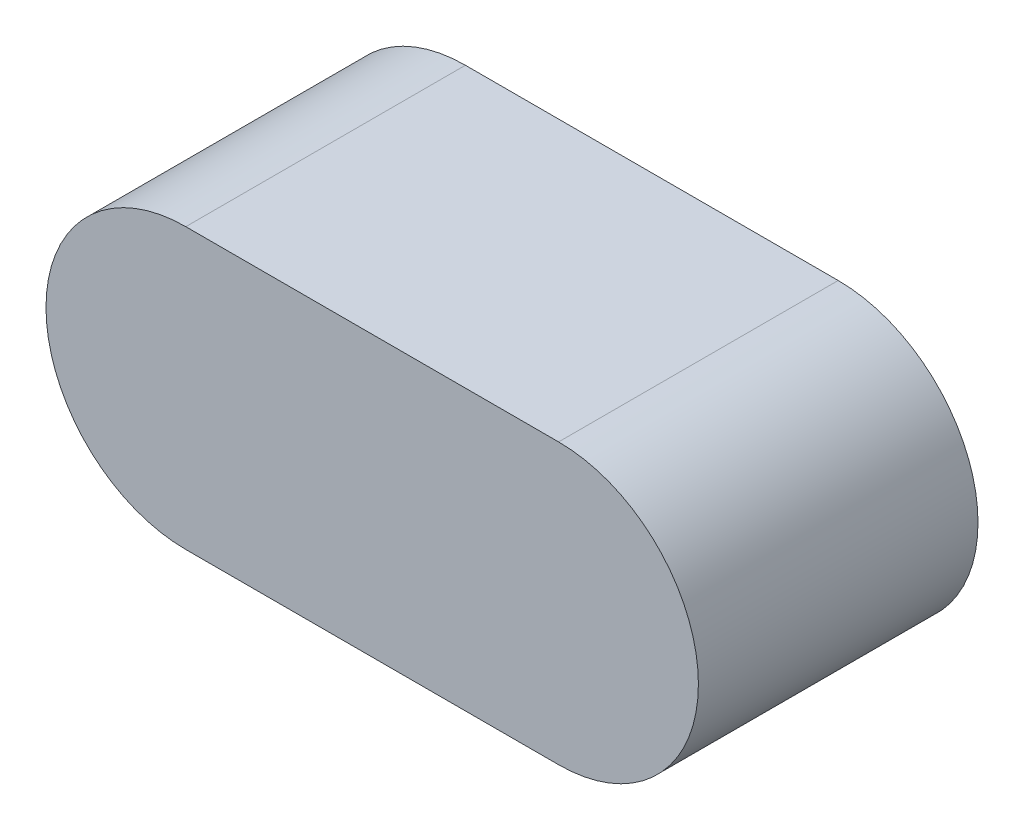
ISO-10303-21;
HEADER;
FILE_DESCRIPTION(('STEP AP214'),'2;1');
FILE_NAME('part.step','',(''),(''),'','','');
FILE_SCHEMA(('AUTOMOTIVE_DESIGN { 1 0 10303 214 1 1 1 1 }'));
ENDSEC;
DATA;
#1=APPLICATION_CONTEXT('core data for automotive mechanical design processes');
#2=APPLICATION_PROTOCOL_DEFINITION('international standard','automotive_design',2000,#1);
#3=PRODUCT_CONTEXT('',#1,'mechanical');
#4=PRODUCT('Part','Part','',(#3));
#5=PRODUCT_RELATED_PRODUCT_CATEGORY('part','',(#4));
#6=PRODUCT_DEFINITION_FORMATION('','',#4);
#7=PRODUCT_DEFINITION_CONTEXT('part definition',#1,'design');
#8=PRODUCT_DEFINITION('design','',#6,#7);
#9=PRODUCT_DEFINITION_SHAPE('','',#8);
#10=(LENGTH_UNIT() NAMED_UNIT(*) SI_UNIT(.MILLI.,.METRE.));
#11=(NAMED_UNIT(*) PLANE_ANGLE_UNIT() SI_UNIT($,.RADIAN.));
#12=(NAMED_UNIT(*) SI_UNIT($,.STERADIAN.) SOLID_ANGLE_UNIT());
#13=UNCERTAINTY_MEASURE_WITH_UNIT(LENGTH_MEASURE(1.E-05),#10,'distance_accuracy_value','');
#14=(GEOMETRIC_REPRESENTATION_CONTEXT(3) GLOBAL_UNCERTAINTY_ASSIGNED_CONTEXT((#13)) GLOBAL_UNIT_ASSIGNED_CONTEXT((#10,
#11,#12)) REPRESENTATION_CONTEXT('',''));
#15=CARTESIAN_POINT('',(0.,0.,0.));
#16=DIRECTION('',(0.,0.,1.));
#17=DIRECTION('',(1.,0.,0.));
#18=AXIS2_PLACEMENT_3D('',#15,#16,#17);
#19=CARTESIAN_POINT('',(0.,0.,3.));
#20=DIRECTION('',(0.,0.,-1.));
#21=DIRECTION('',(-1.,0.,0.));
#22=AXIS2_PLACEMENT_3D('',#19,#20,#21);
#23=CYLINDRICAL_SURFACE('',#22,1.5);
#24=CARTESIAN_POINT('',(0.,0.,0.));
#25=DIRECTION('',(0.,0.,1.));
#26=DIRECTION('',(1.,0.,0.));
#27=AXIS2_PLACEMENT_3D('',#24,#25,#26);
#28=CIRCLE('',#27,1.5);
#29=CARTESIAN_POINT('',(0.,1.5,0.));
#30=VERTEX_POINT('',#29);
#31=CARTESIAN_POINT('',(0.,-1.5,0.));
#32=VERTEX_POINT('',#31);
#33=EDGE_CURVE('E96',#30,#32,#28,.T.);
#34=ORIENTED_EDGE('',*,*,#33,.T.);
#35=DIRECTION('',(0.,0.,-1.));
#36=VECTOR('',#35,1.);
#37=CARTESIAN_POINT('',(0.,-1.5,3.));
#38=LINE('',#37,#36);
#39=CARTESIAN_POINT('',(0.,-1.5,3.));
#40=VERTEX_POINT('',#39);
#41=EDGE_CURVE('E11',#40,#32,#38,.T.);
#42=ORIENTED_EDGE('',*,*,#41,.F.);
#43=CARTESIAN_POINT('',(0.,0.,3.));
#44=DIRECTION('',(0.,0.,1.));
#45=DIRECTION('',(1.,0.,0.));
#46=AXIS2_PLACEMENT_3D('',#43,#44,#45);
#47=CIRCLE('',#46,1.5);
#48=CARTESIAN_POINT('',(0.,1.5,3.));
#49=VERTEX_POINT('',#48);
#50=EDGE_CURVE('E84',#49,#40,#47,.T.);
#51=ORIENTED_EDGE('',*,*,#50,.F.);
#52=DIRECTION('',(0.,0.,-1.));
#53=VECTOR('',#52,1.);
#54=CARTESIAN_POINT('',(0.,1.5,3.));
#55=LINE('',#54,#53);
#56=EDGE_CURVE('E92',#49,#30,#55,.T.);
#57=ORIENTED_EDGE('',*,*,#56,.T.);
#58=EDGE_LOOP('',(#34,#42,#51,#57));
#59=FACE_BOUND('',#58,.T.);
#60=ADVANCED_FACE('F33',(#59),#23,.T.);
#61=CARTESIAN_POINT('',(0.,-1.5,3.));
#62=DIRECTION('',(0.,1.,0.));
#63=DIRECTION('',(0.,0.,1.));
#64=AXIS2_PLACEMENT_3D('',#61,#62,#63);
#65=PLANE('',#64);
#66=DIRECTION('',(1.,0.,0.));
#67=VECTOR('',#66,1.);
#68=CARTESIAN_POINT('',(0.,-1.5,0.));
#69=LINE('',#68,#67);
#70=CARTESIAN_POINT('',(4.,-1.5,0.));
#71=VERTEX_POINT('',#70);
#72=EDGE_CURVE('E88',#32,#71,#69,.T.);
#73=ORIENTED_EDGE('',*,*,#72,.T.);
#74=DIRECTION('',(0.,0.,-1.));
#75=VECTOR('',#74,1.);
#76=CARTESIAN_POINT('',(4.,-1.5,3.));
#77=LINE('',#76,#75);
#78=CARTESIAN_POINT('',(4.,-1.5,3.));
#79=VERTEX_POINT('',#78);
#80=EDGE_CURVE('E41',#79,#71,#77,.T.);
#81=ORIENTED_EDGE('',*,*,#80,.F.);
#82=DIRECTION('',(1.,0.,0.));
#83=VECTOR('',#82,1.);
#84=CARTESIAN_POINT('',(0.,-1.5,3.));
#85=LINE('',#84,#83);
#86=EDGE_CURVE('E79',#40,#79,#85,.T.);
#87=ORIENTED_EDGE('',*,*,#86,.F.);
#88=ORIENTED_EDGE('',*,*,#41,.T.);
#89=EDGE_LOOP('',(#73,#81,#87,#88));
#90=FACE_BOUND('',#89,.T.);
#91=ADVANCED_FACE('F87',(#90),#65,.F.);
#92=CARTESIAN_POINT('',(4.,0.,3.));
#93=DIRECTION('',(0.,0.,-1.));
#94=DIRECTION('',(-1.,0.,0.));
#95=AXIS2_PLACEMENT_3D('',#92,#93,#94);
#96=CYLINDRICAL_SURFACE('',#95,1.5);
#97=CARTESIAN_POINT('',(4.,0.,0.));
#98=DIRECTION('',(0.,0.,1.));
#99=DIRECTION('',(1.,0.,0.));
#100=AXIS2_PLACEMENT_3D('',#97,#98,#99);
#101=CIRCLE('',#100,1.5);
#102=CARTESIAN_POINT('',(4.,1.5,0.));
#103=VERTEX_POINT('',#102);
#104=EDGE_CURVE('E66',#71,#103,#101,.T.);
#105=ORIENTED_EDGE('',*,*,#104,.T.);
#106=DIRECTION('',(0.,0.,-1.));
#107=VECTOR('',#106,1.);
#108=CARTESIAN_POINT('',(4.,1.5,3.));
#109=LINE('',#108,#107);
#110=CARTESIAN_POINT('',(4.,1.5,3.));
#111=VERTEX_POINT('',#110);
#112=EDGE_CURVE('E89',#111,#103,#109,.T.);
#113=ORIENTED_EDGE('',*,*,#112,.F.);
#114=CARTESIAN_POINT('',(4.,0.,3.));
#115=DIRECTION('',(0.,0.,1.));
#116=DIRECTION('',(1.,0.,0.));
#117=AXIS2_PLACEMENT_3D('',#114,#115,#116);
#118=CIRCLE('',#117,1.5);
#119=EDGE_CURVE('E82',#79,#111,#118,.T.);
#120=ORIENTED_EDGE('',*,*,#119,.F.);
#121=ORIENTED_EDGE('',*,*,#80,.T.);
#122=EDGE_LOOP('',(#105,#113,#120,#121));
#123=FACE_BOUND('',#122,.T.);
#124=ADVANCED_FACE('F90',(#123),#96,.T.);
#125=CARTESIAN_POINT('',(0.,1.5,3.));
#126=DIRECTION('',(0.,-1.,0.));
#127=DIRECTION('',(0.,0.,-1.));
#128=AXIS2_PLACEMENT_3D('',#125,#126,#127);
#129=PLANE('',#128);
#130=DIRECTION('',(-1.,0.,0.));
#131=VECTOR('',#130,1.);
#132=CARTESIAN_POINT('',(0.,1.5,0.));
#133=LINE('',#132,#131);
#134=EDGE_CURVE('E72',#103,#30,#133,.T.);
#135=ORIENTED_EDGE('',*,*,#134,.T.);
#136=ORIENTED_EDGE('',*,*,#56,.F.);
#137=DIRECTION('',(-1.,0.,0.));
#138=VECTOR('',#137,1.);
#139=CARTESIAN_POINT('',(0.,1.5,3.));
#140=LINE('',#139,#138);
#141=EDGE_CURVE('E49',#111,#49,#140,.T.);
#142=ORIENTED_EDGE('',*,*,#141,.F.);
#143=ORIENTED_EDGE('',*,*,#112,.T.);
#144=EDGE_LOOP('',(#135,#136,#142,#143));
#145=FACE_BOUND('',#144,.T.);
#146=ADVANCED_FACE('F103',(#145),#129,.F.);
#147=CARTESIAN_POINT('',(0.,0.,3.));
#148=DIRECTION('',(0.,0.,1.));
#149=DIRECTION('',(1.,0.,0.));
#150=AXIS2_PLACEMENT_3D('',#147,#148,#149);
#151=PLANE('',#150);
#152=ORIENTED_EDGE('',*,*,#50,.T.);
#153=ORIENTED_EDGE('',*,*,#86,.T.);
#154=ORIENTED_EDGE('',*,*,#119,.T.);
#155=ORIENTED_EDGE('',*,*,#141,.T.);
#156=EDGE_LOOP('',(#152,#153,#154,#155));
#157=FACE_BOUND('',#156,.T.);
#158=ADVANCED_FACE('F80',(#157),#151,.T.);
#159=CARTESIAN_POINT('',(0.,0.,0.));
#160=DIRECTION('',(0.,0.,1.));
#161=DIRECTION('',(1.,0.,0.));
#162=AXIS2_PLACEMENT_3D('',#159,#160,#161);
#163=PLANE('',#162);
#164=ORIENTED_EDGE('',*,*,#33,.F.);
#165=ORIENTED_EDGE('',*,*,#134,.F.);
#166=ORIENTED_EDGE('',*,*,#104,.F.);
#167=ORIENTED_EDGE('',*,*,#72,.F.);
#168=EDGE_LOOP('',(#164,#165,#166,#167));
#169=FACE_BOUND('',#168,.T.);
#170=ADVANCED_FACE('F106',(#169),#163,.F.);
#171=CLOSED_SHELL('',(#60,#91,#124,#146,#158,#170));
#172=MANIFOLD_SOLID_BREP('B2',#171);
#173=ADVANCED_BREP_SHAPE_REPRESENTATION('',(#18,#172),#14);
#174=SHAPE_DEFINITION_REPRESENTATION(#9,#173);
ENDSEC;
END-ISO-10303-21;
